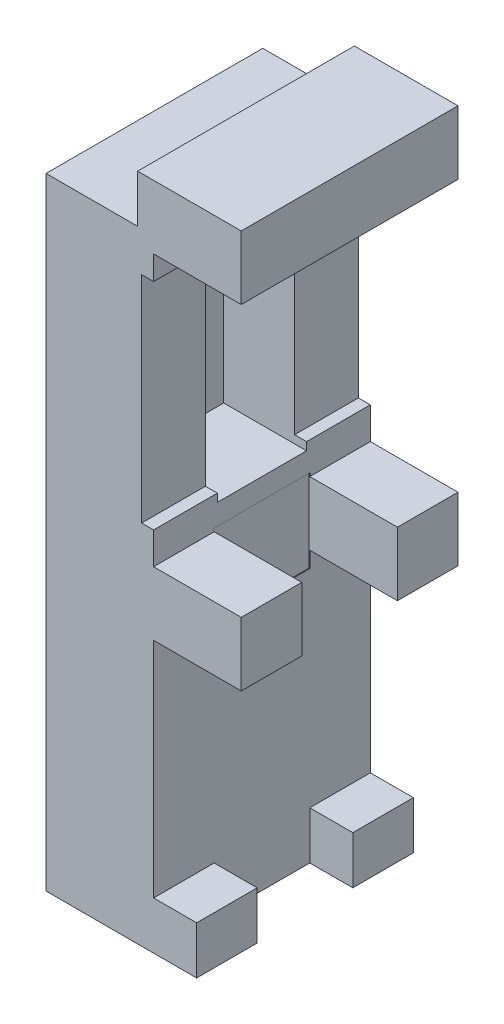
ISO-10303-21;
HEADER;
FILE_DESCRIPTION(('STEP AP214'),'2;1');
FILE_NAME('part.step','',(''),(''),'','','');
FILE_SCHEMA(('AUTOMOTIVE_DESIGN { 1 0 10303 214 1 1 1 1 }'));
ENDSEC;
DATA;
#1=APPLICATION_CONTEXT('core data for automotive mechanical design processes');
#2=APPLICATION_PROTOCOL_DEFINITION('international standard','automotive_design',2000,#1);
#3=PRODUCT_CONTEXT('',#1,'mechanical');
#4=PRODUCT('Part','Part','',(#3));
#5=PRODUCT_RELATED_PRODUCT_CATEGORY('part','',(#4));
#6=PRODUCT_DEFINITION_FORMATION('','',#4);
#7=PRODUCT_DEFINITION_CONTEXT('part definition',#1,'design');
#8=PRODUCT_DEFINITION('design','',#6,#7);
#9=PRODUCT_DEFINITION_SHAPE('','',#8);
#10=(LENGTH_UNIT() NAMED_UNIT(*) SI_UNIT(.MILLI.,.METRE.));
#11=(NAMED_UNIT(*) PLANE_ANGLE_UNIT() SI_UNIT($,.RADIAN.));
#12=(NAMED_UNIT(*) SI_UNIT($,.STERADIAN.) SOLID_ANGLE_UNIT());
#13=UNCERTAINTY_MEASURE_WITH_UNIT(LENGTH_MEASURE(1.E-05),#10,'distance_accuracy_value','');
#14=(GEOMETRIC_REPRESENTATION_CONTEXT(3) GLOBAL_UNCERTAINTY_ASSIGNED_CONTEXT((#13)) GLOBAL_UNIT_ASSIGNED_CONTEXT((#10,
#11,#12)) REPRESENTATION_CONTEXT('',''));
#15=CARTESIAN_POINT('',(0.,0.,0.));
#16=DIRECTION('',(0.,0.,1.));
#17=DIRECTION('',(1.,0.,0.));
#18=AXIS2_PLACEMENT_3D('',#15,#16,#17);
#19=CARTESIAN_POINT('',(-10.2,32.,13.6));
#20=DIRECTION('',(-1.,0.,0.));
#21=DIRECTION('',(0.,0.,1.));
#22=AXIS2_PLACEMENT_3D('',#19,#20,#21);
#23=PLANE('',#22);
#24=DIRECTION('',(0.,-1.,0.));
#25=VECTOR('',#24,1.);
#26=CARTESIAN_POINT('',(-10.2,32.,9.8));
#27=LINE('',#26,#25);
#28=CARTESIAN_POINT('',(-10.2,18.,9.8));
#29=VERTEX_POINT('',#28);
#30=CARTESIAN_POINT('',(-10.2,15.,9.8));
#31=VERTEX_POINT('',#30);
#32=EDGE_CURVE('E11',#29,#31,#27,.T.);
#33=ORIENTED_EDGE('',*,*,#32,.T.);
#34=DIRECTION('',(0.,0.,-1.));
#35=VECTOR('',#34,1.);
#36=CARTESIAN_POINT('',(-10.2,15.,13.6));
#37=LINE('',#36,#35);
#38=CARTESIAN_POINT('',(-10.2,15.,3.8));
#39=VERTEX_POINT('',#38);
#40=EDGE_CURVE('E292',#31,#39,#37,.T.);
#41=ORIENTED_EDGE('',*,*,#40,.T.);
#42=DIRECTION('',(0.,-1.,0.));
#43=VECTOR('',#42,1.);
#44=CARTESIAN_POINT('',(-10.2,32.,3.8));
#45=LINE('',#44,#43);
#46=CARTESIAN_POINT('',(-10.2,18.,3.8));
#47=VERTEX_POINT('',#46);
#48=EDGE_CURVE('E46',#47,#39,#45,.T.);
#49=ORIENTED_EDGE('',*,*,#48,.F.);
#50=DIRECTION('',(0.,0.,1.));
#51=VECTOR('',#50,1.);
#52=CARTESIAN_POINT('',(-10.2,18.,13.6));
#53=LINE('',#52,#51);
#54=CARTESIAN_POINT('',(-10.2,18.,0.));
#55=VERTEX_POINT('',#54);
#56=EDGE_CURVE('E429',#55,#47,#53,.T.);
#57=ORIENTED_EDGE('',*,*,#56,.F.);
#58=DIRECTION('',(0.,1.,0.));
#59=VECTOR('',#58,1.);
#60=CARTESIAN_POINT('',(-10.2,32.,0.));
#61=LINE('',#60,#59);
#62=CARTESIAN_POINT('',(-10.2,32.,0.));
#63=VERTEX_POINT('',#62);
#64=EDGE_CURVE('E306',#55,#63,#61,.T.);
#65=ORIENTED_EDGE('',*,*,#64,.T.);
#66=DIRECTION('',(0.,0.,-1.));
#67=VECTOR('',#66,1.);
#68=CARTESIAN_POINT('',(-10.2,32.,13.6));
#69=LINE('',#68,#67);
#70=CARTESIAN_POINT('',(-10.2,32.,3.8));
#71=VERTEX_POINT('',#70);
#72=EDGE_CURVE('E384',#71,#63,#69,.T.);
#73=ORIENTED_EDGE('',*,*,#72,.F.);
#74=DIRECTION('',(0.,-1.,0.));
#75=VECTOR('',#74,1.);
#76=CARTESIAN_POINT('',(-10.2,32.,3.8));
#77=LINE('',#76,#75);
#78=CARTESIAN_POINT('',(-10.2,31.,3.8));
#79=VERTEX_POINT('',#78);
#80=EDGE_CURVE('E469',#71,#79,#77,.T.);
#81=ORIENTED_EDGE('',*,*,#80,.T.);
#82=DIRECTION('',(0.,0.,1.));
#83=VECTOR('',#82,1.);
#84=CARTESIAN_POINT('',(-10.2,31.,13.6));
#85=LINE('',#84,#83);
#86=CARTESIAN_POINT('',(-10.2,31.,9.8));
#87=VERTEX_POINT('',#86);
#88=EDGE_CURVE('E399',#79,#87,#85,.T.);
#89=ORIENTED_EDGE('',*,*,#88,.T.);
#90=DIRECTION('',(0.,-1.,0.));
#91=VECTOR('',#90,1.);
#92=CARTESIAN_POINT('',(-10.2,32.,9.8));
#93=LINE('',#92,#91);
#94=CARTESIAN_POINT('',(-10.2,32.,9.8));
#95=VERTEX_POINT('',#94);
#96=EDGE_CURVE('E458',#95,#87,#93,.T.);
#97=ORIENTED_EDGE('',*,*,#96,.F.);
#98=CARTESIAN_POINT('',(-10.2,32.,13.6));
#99=VERTEX_POINT('',#98);
#100=EDGE_CURVE('E385',#99,#95,#69,.T.);
#101=ORIENTED_EDGE('',*,*,#100,.F.);
#102=DIRECTION('',(0.,1.,0.));
#103=VECTOR('',#102,1.);
#104=CARTESIAN_POINT('',(-10.2,32.,13.6));
#105=LINE('',#104,#103);
#106=CARTESIAN_POINT('',(-10.2,18.,13.6));
#107=VERTEX_POINT('',#106);
#108=EDGE_CURVE('E342',#107,#99,#105,.T.);
#109=ORIENTED_EDGE('',*,*,#108,.F.);
#110=DIRECTION('',(0.,0.,1.));
#111=VECTOR('',#110,1.);
#112=CARTESIAN_POINT('',(-10.2,18.,13.6));
#113=LINE('',#112,#111);
#114=EDGE_CURVE('E423',#29,#107,#113,.T.);
#115=ORIENTED_EDGE('',*,*,#114,.F.);
#116=EDGE_LOOP('',(#33,#41,#49,#57,#65,#73,#81,#89,#97,#101,#109,#115));
#117=FACE_BOUND('',#116,.T.);
#118=ADVANCED_FACE('F39',(#117),#23,.F.);
#119=CARTESIAN_POINT('',(-4.7,32.,13.6));
#120=DIRECTION('',(0.,1.,0.));
#121=DIRECTION('',(0.,0.,1.));
#122=AXIS2_PLACEMENT_3D('',#119,#120,#121);
#123=PLANE('',#122);
#124=DIRECTION('',(-1.,0.,0.));
#125=VECTOR('',#124,1.);
#126=CARTESIAN_POINT('',(-4.7,32.,9.8));
#127=LINE('',#126,#125);
#128=CARTESIAN_POINT('',(-4.7,32.,9.8));
#129=VERTEX_POINT('',#128);
#130=EDGE_CURVE('E456',#129,#95,#127,.T.);
#131=ORIENTED_EDGE('',*,*,#130,.F.);
#132=DIRECTION('',(0.,0.,-1.));
#133=VECTOR('',#132,1.);
#134=CARTESIAN_POINT('',(-4.7,32.,13.6));
#135=LINE('',#134,#133);
#136=CARTESIAN_POINT('',(-4.7,32.,13.6));
#137=VERTEX_POINT('',#136);
#138=EDGE_CURVE('E381',#137,#129,#135,.T.);
#139=ORIENTED_EDGE('',*,*,#138,.F.);
#140=DIRECTION('',(1.,0.,0.));
#141=VECTOR('',#140,1.);
#142=CARTESIAN_POINT('',(-4.7,32.,13.6));
#143=LINE('',#142,#141);
#144=EDGE_CURVE('E508',#99,#137,#143,.T.);
#145=ORIENTED_EDGE('',*,*,#144,.F.);
#146=ORIENTED_EDGE('',*,*,#100,.T.);
#147=EDGE_LOOP('',(#131,#139,#145,#146));
#148=FACE_BOUND('',#147,.T.);
#149=ADVANCED_FACE('F628',(#148),#123,.F.);
#150=CARTESIAN_POINT('',(-4.7,36.,13.6));
#151=DIRECTION('',(-1.,0.,0.));
#152=DIRECTION('',(0.,0.,1.));
#153=AXIS2_PLACEMENT_3D('',#150,#151,#152);
#154=PLANE('',#153);
#155=DIRECTION('',(0.,-1.,0.));
#156=VECTOR('',#155,1.);
#157=CARTESIAN_POINT('',(-4.7,36.,9.8));
#158=LINE('',#157,#156);
#159=CARTESIAN_POINT('',(-4.7,36.,9.8));
#160=VERTEX_POINT('',#159);
#161=EDGE_CURVE('E454',#160,#129,#158,.T.);
#162=ORIENTED_EDGE('',*,*,#161,.F.);
#163=DIRECTION('',(0.,0.,-1.));
#164=VECTOR('',#163,1.);
#165=CARTESIAN_POINT('',(-4.7,36.,13.6));
#166=LINE('',#165,#164);
#167=CARTESIAN_POINT('',(-4.7,36.,13.6));
#168=VERTEX_POINT('',#167);
#169=EDGE_CURVE('E377',#168,#160,#166,.T.);
#170=ORIENTED_EDGE('',*,*,#169,.F.);
#171=DIRECTION('',(0.,1.,0.));
#172=VECTOR('',#171,1.);
#173=CARTESIAN_POINT('',(-4.7,36.,13.6));
#174=LINE('',#173,#172);
#175=EDGE_CURVE('E510',#137,#168,#174,.T.);
#176=ORIENTED_EDGE('',*,*,#175,.F.);
#177=ORIENTED_EDGE('',*,*,#138,.T.);
#178=EDGE_LOOP('',(#162,#170,#176,#177));
#179=FACE_BOUND('',#178,.T.);
#180=ADVANCED_FACE('F636',(#179),#154,.F.);
#181=CARTESIAN_POINT('',(-10.2,36.,13.6));
#182=DIRECTION('',(0.,-1.,0.));
#183=DIRECTION('',(0.,0.,-1.));
#184=AXIS2_PLACEMENT_3D('',#181,#182,#183);
#185=PLANE('',#184);
#186=DIRECTION('',(1.,0.,0.));
#187=VECTOR('',#186,1.);
#188=CARTESIAN_POINT('',(-10.2,36.,9.8));
#189=LINE('',#188,#187);
#190=CARTESIAN_POINT('',(-10.2,36.,9.8));
#191=VERTEX_POINT('',#190);
#192=EDGE_CURVE('E450',#191,#160,#189,.T.);
#193=ORIENTED_EDGE('',*,*,#192,.F.);
#194=DIRECTION('',(0.,0.,-1.));
#195=VECTOR('',#194,1.);
#196=CARTESIAN_POINT('',(-10.2,36.,13.6));
#197=LINE('',#196,#195);
#198=CARTESIAN_POINT('',(-10.2,36.,13.6));
#199=VERTEX_POINT('',#198);
#200=EDGE_CURVE('E373',#199,#191,#197,.T.);
#201=ORIENTED_EDGE('',*,*,#200,.F.);
#202=DIRECTION('',(-1.,0.,0.));
#203=VECTOR('',#202,1.);
#204=CARTESIAN_POINT('',(-10.2,36.,13.6));
#205=LINE('',#204,#203);
#206=EDGE_CURVE('E512',#168,#199,#205,.T.);
#207=ORIENTED_EDGE('',*,*,#206,.F.);
#208=ORIENTED_EDGE('',*,*,#169,.T.);
#209=EDGE_LOOP('',(#193,#201,#207,#208));
#210=FACE_BOUND('',#209,.T.);
#211=ADVANCED_FACE('F639',(#210),#185,.F.);
#212=CARTESIAN_POINT('',(-10.95,38.,13.6));
#213=DIRECTION('',(0.,-1.,0.));
#214=DIRECTION('',(0.,0.,-1.));
#215=AXIS2_PLACEMENT_3D('',#212,#213,#214);
#216=PLANE('',#215);
#217=DIRECTION('',(1.,0.,0.));
#218=VECTOR('',#217,1.);
#219=CARTESIAN_POINT('',(-10.95,38.,9.6));
#220=LINE('',#219,#218);
#221=CARTESIAN_POINT('',(-10.95,38.,9.6));
#222=VERTEX_POINT('',#221);
#223=CARTESIAN_POINT('',(-10.2,38.,9.6));
#224=VERTEX_POINT('',#223);
#225=EDGE_CURVE('E495',#222,#224,#220,.T.);
#226=ORIENTED_EDGE('',*,*,#225,.F.);
#227=DIRECTION('',(0.,0.,-1.));
#228=VECTOR('',#227,1.);
#229=CARTESIAN_POINT('',(-10.95,38.,13.6));
#230=LINE('',#229,#228);
#231=CARTESIAN_POINT('',(-10.95,38.,13.6));
#232=VERTEX_POINT('',#231);
#233=EDGE_CURVE('E365',#232,#222,#230,.T.);
#234=ORIENTED_EDGE('',*,*,#233,.F.);
#235=DIRECTION('',(-1.,0.,0.));
#236=VECTOR('',#235,1.);
#237=CARTESIAN_POINT('',(-10.95,38.,13.6));
#238=LINE('',#237,#236);
#239=CARTESIAN_POINT('',(-10.2,38.,13.6));
#240=VERTEX_POINT('',#239);
#241=EDGE_CURVE('E516',#240,#232,#238,.T.);
#242=ORIENTED_EDGE('',*,*,#241,.F.);
#243=DIRECTION('',(0.,0.,-1.));
#244=VECTOR('',#243,1.);
#245=CARTESIAN_POINT('',(-10.2,38.,13.6));
#246=LINE('',#245,#244);
#247=EDGE_CURVE('E369',#240,#224,#246,.T.);
#248=ORIENTED_EDGE('',*,*,#247,.T.);
#249=EDGE_LOOP('',(#226,#234,#242,#248));
#250=FACE_BOUND('',#249,.T.);
#251=ADVANCED_FACE('F650',(#250),#216,.F.);
#252=CARTESIAN_POINT('',(-10.95,51.5,13.6));
#253=DIRECTION('',(-1.,0.,0.));
#254=DIRECTION('',(0.,0.,1.));
#255=AXIS2_PLACEMENT_3D('',#252,#253,#254);
#256=PLANE('',#255);
#257=DIRECTION('',(0.,-1.,0.));
#258=VECTOR('',#257,1.);
#259=CARTESIAN_POINT('',(-10.95,51.5,9.6));
#260=LINE('',#259,#258);
#261=CARTESIAN_POINT('',(-10.95,51.5,9.6));
#262=VERTEX_POINT('',#261);
#263=EDGE_CURVE('E491',#262,#222,#260,.T.);
#264=ORIENTED_EDGE('',*,*,#263,.F.);
#265=DIRECTION('',(0.,0.,-1.));
#266=VECTOR('',#265,1.);
#267=CARTESIAN_POINT('',(-10.95,51.5,13.6));
#268=LINE('',#267,#266);
#269=CARTESIAN_POINT('',(-10.95,51.5,13.6));
#270=VERTEX_POINT('',#269);
#271=EDGE_CURVE('E361',#270,#262,#268,.T.);
#272=ORIENTED_EDGE('',*,*,#271,.F.);
#273=DIRECTION('',(0.,1.,0.));
#274=VECTOR('',#273,1.);
#275=CARTESIAN_POINT('',(-10.95,51.5,13.6));
#276=LINE('',#275,#274);
#277=EDGE_CURVE('E518',#232,#270,#276,.T.);
#278=ORIENTED_EDGE('',*,*,#277,.F.);
#279=ORIENTED_EDGE('',*,*,#233,.T.);
#280=EDGE_LOOP('',(#264,#272,#278,#279));
#281=FACE_BOUND('',#280,.T.);
#282=ADVANCED_FACE('F653',(#281),#256,.F.);
#283=CARTESIAN_POINT('',(-4.7,32.,3.8));
#284=VERTEX_POINT('',#283);
#285=CARTESIAN_POINT('',(-4.7,32.,0.));
#286=VERTEX_POINT('',#285);
#287=EDGE_CURVE('E380',#284,#286,#135,.T.);
#288=ORIENTED_EDGE('',*,*,#287,.F.);
#289=DIRECTION('',(-1.,0.,0.));
#290=VECTOR('',#289,1.);
#291=CARTESIAN_POINT('',(-4.7,32.,3.8));
#292=LINE('',#291,#290);
#293=EDGE_CURVE('E466',#284,#71,#292,.T.);
#294=ORIENTED_EDGE('',*,*,#293,.T.);
#295=ORIENTED_EDGE('',*,*,#72,.T.);
#296=DIRECTION('',(1.,0.,0.));
#297=VECTOR('',#296,1.);
#298=CARTESIAN_POINT('',(-4.7,32.,0.));
#299=LINE('',#298,#297);
#300=EDGE_CURVE('E308',#63,#286,#299,.T.);
#301=ORIENTED_EDGE('',*,*,#300,.T.);
#302=EDGE_LOOP('',(#288,#294,#295,#301));
#303=FACE_BOUND('',#302,.T.);
#304=ADVANCED_FACE('F589',(#303),#123,.F.);
#305=CARTESIAN_POINT('',(-4.7,36.,3.8));
#306=VERTEX_POINT('',#305);
#307=CARTESIAN_POINT('',(-4.7,36.,0.));
#308=VERTEX_POINT('',#307);
#309=EDGE_CURVE('E376',#306,#308,#166,.T.);
#310=ORIENTED_EDGE('',*,*,#309,.F.);
#311=DIRECTION('',(0.,-1.,0.));
#312=VECTOR('',#311,1.);
#313=CARTESIAN_POINT('',(-4.7,36.,3.8));
#314=LINE('',#313,#312);
#315=EDGE_CURVE('E463',#306,#284,#314,.T.);
#316=ORIENTED_EDGE('',*,*,#315,.T.);
#317=ORIENTED_EDGE('',*,*,#287,.T.);
#318=DIRECTION('',(0.,1.,0.));
#319=VECTOR('',#318,1.);
#320=CARTESIAN_POINT('',(-4.7,36.,0.));
#321=LINE('',#320,#319);
#322=EDGE_CURVE('E312',#286,#308,#321,.T.);
#323=ORIENTED_EDGE('',*,*,#322,.T.);
#324=EDGE_LOOP('',(#310,#316,#317,#323));
#325=FACE_BOUND('',#324,.T.);
#326=ADVANCED_FACE('F585',(#325),#154,.F.);
#327=CARTESIAN_POINT('',(-10.2,36.,3.8));
#328=VERTEX_POINT('',#327);
#329=CARTESIAN_POINT('',(-10.2,36.,0.));
#330=VERTEX_POINT('',#329);
#331=EDGE_CURVE('E372',#328,#330,#197,.T.);
#332=ORIENTED_EDGE('',*,*,#331,.F.);
#333=DIRECTION('',(1.,0.,0.));
#334=VECTOR('',#333,1.);
#335=CARTESIAN_POINT('',(-10.2,36.,3.8));
#336=LINE('',#335,#334);
#337=EDGE_CURVE('E460',#328,#306,#336,.T.);
#338=ORIENTED_EDGE('',*,*,#337,.T.);
#339=ORIENTED_EDGE('',*,*,#309,.T.);
#340=DIRECTION('',(-1.,0.,0.));
#341=VECTOR('',#340,1.);
#342=CARTESIAN_POINT('',(-10.2,36.,0.));
#343=LINE('',#342,#341);
#344=EDGE_CURVE('E315',#308,#330,#343,.T.);
#345=ORIENTED_EDGE('',*,*,#344,.T.);
#346=EDGE_LOOP('',(#332,#338,#339,#345));
#347=FACE_BOUND('',#346,.T.);
#348=ADVANCED_FACE('F580',(#347),#185,.F.);
#349=CARTESIAN_POINT('',(-10.2,38.,13.6));
#350=DIRECTION('',(-1.,0.,0.));
#351=DIRECTION('',(0.,0.,1.));
#352=AXIS2_PLACEMENT_3D('',#349,#350,#351);
#353=PLANE('',#352);
#354=DIRECTION('',(0.,0.,-1.));
#355=VECTOR('',#354,1.);
#356=CARTESIAN_POINT('',(-10.2,36.2,13.6));
#357=LINE('',#356,#355);
#358=CARTESIAN_POINT('',(-10.2,36.2,9.8));
#359=VERTEX_POINT('',#358);
#360=CARTESIAN_POINT('',(-10.2,36.2,3.8));
#361=VERTEX_POINT('',#360);
#362=EDGE_CURVE('E393',#359,#361,#357,.T.);
#363=ORIENTED_EDGE('',*,*,#362,.T.);
#364=DIRECTION('',(0.,-1.,0.));
#365=VECTOR('',#364,1.);
#366=CARTESIAN_POINT('',(-10.2,38.,3.8));
#367=LINE('',#366,#365);
#368=EDGE_CURVE('E396',#361,#328,#367,.T.);
#369=ORIENTED_EDGE('',*,*,#368,.T.);
#370=ORIENTED_EDGE('',*,*,#331,.T.);
#371=DIRECTION('',(0.,1.,0.));
#372=VECTOR('',#371,1.);
#373=CARTESIAN_POINT('',(-10.2,38.,0.));
#374=LINE('',#373,#372);
#375=CARTESIAN_POINT('',(-10.2,38.,0.));
#376=VERTEX_POINT('',#375);
#377=EDGE_CURVE('E318',#330,#376,#374,.T.);
#378=ORIENTED_EDGE('',*,*,#377,.T.);
#379=CARTESIAN_POINT('',(-10.2,38.,4.));
#380=VERTEX_POINT('',#379);
#381=EDGE_CURVE('E368',#380,#376,#246,.T.);
#382=ORIENTED_EDGE('',*,*,#381,.F.);
#383=DIRECTION('',(0.,-1.,0.));
#384=VECTOR('',#383,1.);
#385=CARTESIAN_POINT('',(-10.2,38.,4.));
#386=LINE('',#385,#384);
#387=CARTESIAN_POINT('',(-10.2,37.5,4.));
#388=VERTEX_POINT('',#387);
#389=EDGE_CURVE('E309',#380,#388,#386,.T.);
#390=ORIENTED_EDGE('',*,*,#389,.T.);
#391=DIRECTION('',(0.,0.,1.));
#392=VECTOR('',#391,1.);
#393=CARTESIAN_POINT('',(-10.2,37.5,13.6));
#394=LINE('',#393,#392);
#395=CARTESIAN_POINT('',(-10.2,37.5,9.6));
#396=VERTEX_POINT('',#395);
#397=EDGE_CURVE('E388',#388,#396,#394,.T.);
#398=ORIENTED_EDGE('',*,*,#397,.T.);
#399=DIRECTION('',(0.,-1.,0.));
#400=VECTOR('',#399,1.);
#401=CARTESIAN_POINT('',(-10.2,38.,9.6));
#402=LINE('',#401,#400);
#403=EDGE_CURVE('E497',#224,#396,#402,.T.);
#404=ORIENTED_EDGE('',*,*,#403,.F.);
#405=ORIENTED_EDGE('',*,*,#247,.F.);
#406=DIRECTION('',(0.,1.,0.));
#407=VECTOR('',#406,1.);
#408=CARTESIAN_POINT('',(-10.2,38.,13.6));
#409=LINE('',#408,#407);
#410=EDGE_CURVE('E514',#199,#240,#409,.T.);
#411=ORIENTED_EDGE('',*,*,#410,.F.);
#412=ORIENTED_EDGE('',*,*,#200,.T.);
#413=DIRECTION('',(0.,-1.,0.));
#414=VECTOR('',#413,1.);
#415=CARTESIAN_POINT('',(-10.2,38.,9.8));
#416=LINE('',#415,#414);
#417=EDGE_CURVE('E391',#359,#191,#416,.T.);
#418=ORIENTED_EDGE('',*,*,#417,.F.);
#419=EDGE_LOOP('',(#363,#369,#370,#378,#382,#390,#398,#404,#405,#411,#412,#418));
#420=FACE_BOUND('',#419,.T.);
#421=ADVANCED_FACE('F577',(#420),#353,.F.);
#422=CARTESIAN_POINT('',(-10.95,38.,4.));
#423=VERTEX_POINT('',#422);
#424=CARTESIAN_POINT('',(-10.95,38.,0.));
#425=VERTEX_POINT('',#424);
#426=EDGE_CURVE('E364',#423,#425,#230,.T.);
#427=ORIENTED_EDGE('',*,*,#426,.F.);
#428=DIRECTION('',(1.,0.,0.));
#429=VECTOR('',#428,1.);
#430=CARTESIAN_POINT('',(-10.95,38.,4.));
#431=LINE('',#430,#429);
#432=EDGE_CURVE('E502',#423,#380,#431,.T.);
#433=ORIENTED_EDGE('',*,*,#432,.T.);
#434=ORIENTED_EDGE('',*,*,#381,.T.);
#435=DIRECTION('',(-1.,0.,0.));
#436=VECTOR('',#435,1.);
#437=CARTESIAN_POINT('',(-10.95,38.,0.));
#438=LINE('',#437,#436);
#439=EDGE_CURVE('E321',#376,#425,#438,.T.);
#440=ORIENTED_EDGE('',*,*,#439,.T.);
#441=EDGE_LOOP('',(#427,#433,#434,#440));
#442=FACE_BOUND('',#441,.T.);
#443=ADVANCED_FACE('F574',(#442),#216,.F.);
#444=CARTESIAN_POINT('',(-10.95,51.5,4.));
#445=VERTEX_POINT('',#444);
#446=CARTESIAN_POINT('',(-10.95,51.5,0.));
#447=VERTEX_POINT('',#446);
#448=EDGE_CURVE('E360',#445,#447,#268,.T.);
#449=ORIENTED_EDGE('',*,*,#448,.F.);
#450=DIRECTION('',(0.,-1.,0.));
#451=VECTOR('',#450,1.);
#452=CARTESIAN_POINT('',(-10.95,51.5,4.));
#453=LINE('',#452,#451);
#454=EDGE_CURVE('E499',#445,#423,#453,.T.);
#455=ORIENTED_EDGE('',*,*,#454,.T.);
#456=ORIENTED_EDGE('',*,*,#426,.T.);
#457=DIRECTION('',(0.,1.,0.));
#458=VECTOR('',#457,1.);
#459=CARTESIAN_POINT('',(-10.95,51.5,0.));
#460=LINE('',#459,#458);
#461=EDGE_CURVE('E324',#425,#447,#460,.T.);
#462=ORIENTED_EDGE('',*,*,#461,.T.);
#463=EDGE_LOOP('',(#449,#455,#456,#462));
#464=FACE_BOUND('',#463,.T.);
#465=ADVANCED_FACE('F568',(#464),#256,.F.);
#466=CARTESIAN_POINT('',(-10.2,51.5,13.6));
#467=DIRECTION('',(0.,1.,0.));
#468=DIRECTION('',(0.,0.,1.));
#469=AXIS2_PLACEMENT_3D('',#466,#467,#468);
#470=PLANE('',#469);
#471=DIRECTION('',(1.,0.,0.));
#472=VECTOR('',#471,1.);
#473=CARTESIAN_POINT('',(-10.2,51.5,0.));
#474=LINE('',#473,#472);
#475=CARTESIAN_POINT('',(-10.2,51.5,0.));
#476=VERTEX_POINT('',#475);
#477=EDGE_CURVE('E327',#447,#476,#474,.T.);
#478=ORIENTED_EDGE('',*,*,#477,.T.);
#479=DIRECTION('',(0.,0.,-1.));
#480=VECTOR('',#479,1.);
#481=CARTESIAN_POINT('',(-10.2,51.5,13.6));
#482=LINE('',#481,#480);
#483=CARTESIAN_POINT('',(-10.2,51.5,13.6));
#484=VERTEX_POINT('',#483);
#485=EDGE_CURVE('E358',#484,#476,#482,.T.);
#486=ORIENTED_EDGE('',*,*,#485,.F.);
#487=DIRECTION('',(1.,0.,0.));
#488=VECTOR('',#487,1.);
#489=CARTESIAN_POINT('',(-10.2,51.5,13.6));
#490=LINE('',#489,#488);
#491=EDGE_CURVE('E520',#270,#484,#490,.T.);
#492=ORIENTED_EDGE('',*,*,#491,.F.);
#493=ORIENTED_EDGE('',*,*,#271,.T.);
#494=DIRECTION('',(-1.,0.,0.));
#495=VECTOR('',#494,1.);
#496=CARTESIAN_POINT('',(-15.4,51.5,9.6));
#497=LINE('',#496,#495);
#498=CARTESIAN_POINT('',(-15.4,51.5,9.6));
#499=VERTEX_POINT('',#498);
#500=EDGE_CURVE('E472',#262,#499,#497,.T.);
#501=ORIENTED_EDGE('',*,*,#500,.T.);
#502=DIRECTION('',(0.,0.,1.));
#503=VECTOR('',#502,1.);
#504=CARTESIAN_POINT('',(-15.4,51.5,4.));
#505=LINE('',#504,#503);
#506=CARTESIAN_POINT('',(-15.4,51.5,4.));
#507=VERTEX_POINT('',#506);
#508=EDGE_CURVE('E482',#507,#499,#505,.T.);
#509=ORIENTED_EDGE('',*,*,#508,.F.);
#510=DIRECTION('',(-1.,0.,0.));
#511=VECTOR('',#510,1.);
#512=CARTESIAN_POINT('',(-15.4,51.5,4.));
#513=LINE('',#512,#511);
#514=EDGE_CURVE('E473',#445,#507,#513,.T.);
#515=ORIENTED_EDGE('',*,*,#514,.F.);
#516=ORIENTED_EDGE('',*,*,#448,.T.);
#517=EDGE_LOOP('',(#478,#486,#492,#493,#501,#509,#515,#516));
#518=FACE_BOUND('',#517,.T.);
#519=ADVANCED_FACE('F563',(#518),#470,.F.);
#520=CARTESIAN_POINT('',(-10.2,53.,13.6));
#521=DIRECTION('',(-1.,0.,0.));
#522=DIRECTION('',(0.,0.,1.));
#523=AXIS2_PLACEMENT_3D('',#520,#521,#522);
#524=PLANE('',#523);
#525=DIRECTION('',(0.,1.,0.));
#526=VECTOR('',#525,1.);
#527=CARTESIAN_POINT('',(-10.2,53.,0.));
#528=LINE('',#527,#526);
#529=CARTESIAN_POINT('',(-10.2,53.,0.));
#530=VERTEX_POINT('',#529);
#531=EDGE_CURVE('E330',#476,#530,#528,.T.);
#532=ORIENTED_EDGE('',*,*,#531,.T.);
#533=DIRECTION('',(0.,0.,-1.));
#534=VECTOR('',#533,1.);
#535=CARTESIAN_POINT('',(-10.2,53.,13.6));
#536=LINE('',#535,#534);
#537=CARTESIAN_POINT('',(-10.2,53.,13.6));
#538=VERTEX_POINT('',#537);
#539=EDGE_CURVE('E355',#538,#530,#536,.T.);
#540=ORIENTED_EDGE('',*,*,#539,.F.);
#541=DIRECTION('',(0.,1.,0.));
#542=VECTOR('',#541,1.);
#543=CARTESIAN_POINT('',(-10.2,53.,13.6));
#544=LINE('',#543,#542);
#545=EDGE_CURVE('E522',#484,#538,#544,.T.);
#546=ORIENTED_EDGE('',*,*,#545,.F.);
#547=ORIENTED_EDGE('',*,*,#485,.T.);
#548=EDGE_LOOP('',(#532,#540,#546,#547));
#549=FACE_BOUND('',#548,.T.);
#550=ADVANCED_FACE('F558',(#549),#524,.F.);
#551=CARTESIAN_POINT('',(-4.7,53.,13.6));
#552=DIRECTION('',(0.,1.,0.));
#553=DIRECTION('',(0.,0.,1.));
#554=AXIS2_PLACEMENT_3D('',#551,#552,#553);
#555=PLANE('',#554);
#556=DIRECTION('',(1.,0.,0.));
#557=VECTOR('',#556,1.);
#558=CARTESIAN_POINT('',(-4.7,53.,0.));
#559=LINE('',#558,#557);
#560=CARTESIAN_POINT('',(-4.7,53.,0.));
#561=VERTEX_POINT('',#560);
#562=EDGE_CURVE('E332',#530,#561,#559,.T.);
#563=ORIENTED_EDGE('',*,*,#562,.T.);
#564=DIRECTION('',(0.,0.,-1.));
#565=VECTOR('',#564,1.);
#566=CARTESIAN_POINT('',(-4.7,53.,13.6));
#567=LINE('',#566,#565);
#568=CARTESIAN_POINT('',(-4.7,53.,13.6));
#569=VERTEX_POINT('',#568);
#570=EDGE_CURVE('E352',#569,#561,#567,.T.);
#571=ORIENTED_EDGE('',*,*,#570,.F.);
#572=DIRECTION('',(1.,0.,0.));
#573=VECTOR('',#572,1.);
#574=CARTESIAN_POINT('',(-4.7,53.,13.6));
#575=LINE('',#574,#573);
#576=EDGE_CURVE('E524',#538,#569,#575,.T.);
#577=ORIENTED_EDGE('',*,*,#576,.F.);
#578=ORIENTED_EDGE('',*,*,#539,.T.);
#579=EDGE_LOOP('',(#563,#571,#577,#578));
#580=FACE_BOUND('',#579,.T.);
#581=ADVANCED_FACE('F552',(#580),#555,.F.);
#582=CARTESIAN_POINT('',(-4.7,57.,13.6));
#583=DIRECTION('',(-1.,0.,0.));
#584=DIRECTION('',(0.,0.,1.));
#585=AXIS2_PLACEMENT_3D('',#582,#583,#584);
#586=PLANE('',#585);
#587=DIRECTION('',(0.,1.,0.));
#588=VECTOR('',#587,1.);
#589=CARTESIAN_POINT('',(-4.7,57.,0.));
#590=LINE('',#589,#588);
#591=CARTESIAN_POINT('',(-4.7,57.,0.));
#592=VERTEX_POINT('',#591);
#593=EDGE_CURVE('E334',#561,#592,#590,.T.);
#594=ORIENTED_EDGE('',*,*,#593,.T.);
#595=DIRECTION('',(0.,0.,-1.));
#596=VECTOR('',#595,1.);
#597=CARTESIAN_POINT('',(-4.7,57.,13.6));
#598=LINE('',#597,#596);
#599=CARTESIAN_POINT('',(-4.7,57.,13.6));
#600=VERTEX_POINT('',#599);
#601=EDGE_CURVE('E349',#600,#592,#598,.T.);
#602=ORIENTED_EDGE('',*,*,#601,.F.);
#603=DIRECTION('',(0.,1.,0.));
#604=VECTOR('',#603,1.);
#605=CARTESIAN_POINT('',(-4.7,57.,13.6));
#606=LINE('',#605,#604);
#607=EDGE_CURVE('E526',#569,#600,#606,.T.);
#608=ORIENTED_EDGE('',*,*,#607,.F.);
#609=ORIENTED_EDGE('',*,*,#570,.T.);
#610=EDGE_LOOP('',(#594,#602,#608,#609));
#611=FACE_BOUND('',#610,.T.);
#612=ADVANCED_FACE('F548',(#611),#586,.F.);
#613=CARTESIAN_POINT('',(-11.2,57.,13.6));
#614=DIRECTION('',(0.,-1.,0.));
#615=DIRECTION('',(0.,0.,-1.));
#616=AXIS2_PLACEMENT_3D('',#613,#614,#615);
#617=PLANE('',#616);
#618=DIRECTION('',(-1.,0.,0.));
#619=VECTOR('',#618,1.);
#620=CARTESIAN_POINT('',(-11.2,57.,0.));
#621=LINE('',#620,#619);
#622=CARTESIAN_POINT('',(-11.2,57.,0.));
#623=VERTEX_POINT('',#622);
#624=EDGE_CURVE('E336',#592,#623,#621,.T.);
#625=ORIENTED_EDGE('',*,*,#624,.T.);
#626=DIRECTION('',(0.,0.,-1.));
#627=VECTOR('',#626,1.);
#628=CARTESIAN_POINT('',(-11.2,57.,13.6));
#629=LINE('',#628,#627);
#630=CARTESIAN_POINT('',(-11.2,57.,13.6));
#631=VERTEX_POINT('',#630);
#632=EDGE_CURVE('E346',#631,#623,#629,.T.);
#633=ORIENTED_EDGE('',*,*,#632,.F.);
#634=DIRECTION('',(-1.,0.,0.));
#635=VECTOR('',#634,1.);
#636=CARTESIAN_POINT('',(-11.2,57.,13.6));
#637=LINE('',#636,#635);
#638=EDGE_CURVE('E528',#600,#631,#637,.T.);
#639=ORIENTED_EDGE('',*,*,#638,.F.);
#640=ORIENTED_EDGE('',*,*,#601,.T.);
#641=EDGE_LOOP('',(#625,#633,#639,#640));
#642=FACE_BOUND('',#641,.T.);
#643=ADVANCED_FACE('F544',(#642),#617,.F.);
#644=CARTESIAN_POINT('',(-11.2,54.,13.6));
#645=DIRECTION('',(1.,0.,0.));
#646=DIRECTION('',(0.,0.,-1.));
#647=AXIS2_PLACEMENT_3D('',#644,#645,#646);
#648=PLANE('',#647);
#649=DIRECTION('',(0.,-1.,0.));
#650=VECTOR('',#649,1.);
#651=CARTESIAN_POINT('',(-11.2,54.,0.));
#652=LINE('',#651,#650);
#653=CARTESIAN_POINT('',(-11.2,54.,0.));
#654=VERTEX_POINT('',#653);
#655=EDGE_CURVE('E338',#623,#654,#652,.T.);
#656=ORIENTED_EDGE('',*,*,#655,.T.);
#657=DIRECTION('',(0.,0.,-1.));
#658=VECTOR('',#657,1.);
#659=CARTESIAN_POINT('',(-11.2,54.,13.6));
#660=LINE('',#659,#658);
#661=CARTESIAN_POINT('',(-11.2,54.,13.6));
#662=VERTEX_POINT('',#661);
#663=EDGE_CURVE('E300',#662,#654,#660,.T.);
#664=ORIENTED_EDGE('',*,*,#663,.F.);
#665=DIRECTION('',(0.,-1.,0.));
#666=VECTOR('',#665,1.);
#667=CARTESIAN_POINT('',(-11.2,54.,13.6));
#668=LINE('',#667,#666);
#669=EDGE_CURVE('E302',#631,#662,#668,.T.);
#670=ORIENTED_EDGE('',*,*,#669,.F.);
#671=ORIENTED_EDGE('',*,*,#632,.T.);
#672=EDGE_LOOP('',(#656,#664,#670,#671));
#673=FACE_BOUND('',#672,.T.);
#674=ADVANCED_FACE('F534',(#673),#648,.F.);
#675=CARTESIAN_POINT('',(-16.95,54.,13.6));
#676=DIRECTION('',(0.,-1.,0.));
#677=DIRECTION('',(0.,0.,-1.));
#678=AXIS2_PLACEMENT_3D('',#675,#676,#677);
#679=PLANE('',#678);
#680=DIRECTION('',(-1.,0.,0.));
#681=VECTOR('',#680,1.);
#682=CARTESIAN_POINT('',(-16.95,54.,0.));
#683=LINE('',#682,#681);
#684=CARTESIAN_POINT('',(-16.95,54.,0.));
#685=VERTEX_POINT('',#684);
#686=EDGE_CURVE('E340',#654,#685,#683,.T.);
#687=ORIENTED_EDGE('',*,*,#686,.T.);
#688=DIRECTION('',(0.,0.,-1.));
#689=VECTOR('',#688,1.);
#690=CARTESIAN_POINT('',(-16.95,54.,13.6));
#691=LINE('',#690,#689);
#692=CARTESIAN_POINT('',(-16.95,54.,13.6));
#693=VERTEX_POINT('',#692);
#694=EDGE_CURVE('E298',#693,#685,#691,.T.);
#695=ORIENTED_EDGE('',*,*,#694,.F.);
#696=DIRECTION('',(-1.,0.,0.));
#697=VECTOR('',#696,1.);
#698=CARTESIAN_POINT('',(-16.95,54.,13.6));
#699=LINE('',#698,#697);
#700=EDGE_CURVE('E296',#662,#693,#699,.T.);
#701=ORIENTED_EDGE('',*,*,#700,.F.);
#702=ORIENTED_EDGE('',*,*,#663,.T.);
#703=EDGE_LOOP('',(#687,#695,#701,#702));
#704=FACE_BOUND('',#703,.T.);
#705=ADVANCED_FACE('F538',(#704),#679,.F.);
#706=CARTESIAN_POINT('',(-16.95,0.,13.6));
#707=DIRECTION('',(1.,0.,0.));
#708=DIRECTION('',(0.,0.,-1.));
#709=AXIS2_PLACEMENT_3D('',#706,#707,#708);
#710=PLANE('',#709);
#711=DIRECTION('',(0.,-1.,0.));
#712=VECTOR('',#711,1.);
#713=CARTESIAN_POINT('',(-16.95,0.,0.));
#714=LINE('',#713,#712);
#715=CARTESIAN_POINT('',(-16.95,15.,0.));
#716=VERTEX_POINT('',#715);
#717=EDGE_CURVE('E290',#685,#716,#714,.T.);
#718=ORIENTED_EDGE('',*,*,#717,.T.);
#719=DIRECTION('',(0.,0.,1.));
#720=VECTOR('',#719,1.);
#721=CARTESIAN_POINT('',(-16.95,15.,13.6));
#722=LINE('',#721,#720);
#723=CARTESIAN_POINT('',(-16.95,15.,13.6));
#724=VERTEX_POINT('',#723);
#725=EDGE_CURVE('E275',#716,#724,#722,.T.);
#726=ORIENTED_EDGE('',*,*,#725,.T.);
#727=DIRECTION('',(0.,-1.,0.));
#728=VECTOR('',#727,1.);
#729=CARTESIAN_POINT('',(-16.95,0.,13.6));
#730=LINE('',#729,#728);
#731=EDGE_CURVE('E289',#693,#724,#730,.T.);
#732=ORIENTED_EDGE('',*,*,#731,.F.);
#733=ORIENTED_EDGE('',*,*,#694,.T.);
#734=EDGE_LOOP('',(#718,#726,#732,#733));
#735=FACE_BOUND('',#734,.T.);
#736=ADVANCED_FACE('F287',(#735),#710,.F.);
#737=CARTESIAN_POINT('',(0.,0.,13.6));
#738=DIRECTION('',(0.,0.,-1.));
#739=DIRECTION('',(-1.,0.,0.));
#740=AXIS2_PLACEMENT_3D('',#737,#738,#739);
#741=PLANE('',#740);
#742=ORIENTED_EDGE('',*,*,#731,.T.);
#743=DIRECTION('',(1.,0.,0.));
#744=VECTOR('',#743,1.);
#745=CARTESIAN_POINT('',(-7.5,15.,13.6));
#746=LINE('',#745,#744);
#747=CARTESIAN_POINT('',(-7.5,15.,13.6));
#748=VERTEX_POINT('',#747);
#749=EDGE_CURVE('E271',#724,#748,#746,.T.);
#750=ORIENTED_EDGE('',*,*,#749,.T.);
#751=DIRECTION('',(0.,1.,0.));
#752=VECTOR('',#751,1.);
#753=CARTESIAN_POINT('',(-7.5,18.,13.6));
#754=LINE('',#753,#752);
#755=CARTESIAN_POINT('',(-7.5,18.,13.6));
#756=VERTEX_POINT('',#755);
#757=EDGE_CURVE('E604',#748,#756,#754,.T.);
#758=ORIENTED_EDGE('',*,*,#757,.T.);
#759=DIRECTION('',(-1.,0.,0.));
#760=VECTOR('',#759,1.);
#761=CARTESIAN_POINT('',(-11.2,18.,13.6));
#762=LINE('',#761,#760);
#763=EDGE_CURVE('E283',#756,#107,#762,.T.);
#764=ORIENTED_EDGE('',*,*,#763,.T.);
#765=ORIENTED_EDGE('',*,*,#108,.T.);
#766=ORIENTED_EDGE('',*,*,#144,.T.);
#767=ORIENTED_EDGE('',*,*,#175,.T.);
#768=ORIENTED_EDGE('',*,*,#206,.T.);
#769=ORIENTED_EDGE('',*,*,#410,.T.);
#770=ORIENTED_EDGE('',*,*,#241,.T.);
#771=ORIENTED_EDGE('',*,*,#277,.T.);
#772=ORIENTED_EDGE('',*,*,#491,.T.);
#773=ORIENTED_EDGE('',*,*,#545,.T.);
#774=ORIENTED_EDGE('',*,*,#576,.T.);
#775=ORIENTED_EDGE('',*,*,#607,.T.);
#776=ORIENTED_EDGE('',*,*,#638,.T.);
#777=ORIENTED_EDGE('',*,*,#669,.T.);
#778=ORIENTED_EDGE('',*,*,#700,.T.);
#779=EDGE_LOOP('',(#742,#750,#758,#764,#765,#766,#767,#768,#769,#770,#771,#772,#773,#774,#775,
#776,#777,#778));
#780=FACE_BOUND('',#779,.T.);
#781=ADVANCED_FACE('F294',(#780),#741,.F.);
#782=CARTESIAN_POINT('',(0.,0.,0.));
#783=DIRECTION('',(0.,0.,-1.));
#784=DIRECTION('',(-1.,0.,0.));
#785=AXIS2_PLACEMENT_3D('',#782,#783,#784);
#786=PLANE('',#785);
#787=DIRECTION('',(1.,0.,0.));
#788=VECTOR('',#787,1.);
#789=CARTESIAN_POINT('',(-7.5,15.,0.));
#790=LINE('',#789,#788);
#791=CARTESIAN_POINT('',(-7.5,15.,0.));
#792=VERTEX_POINT('',#791);
#793=EDGE_CURVE('E53',#716,#792,#790,.T.);
#794=ORIENTED_EDGE('',*,*,#793,.F.);
#795=ORIENTED_EDGE('',*,*,#717,.F.);
#796=ORIENTED_EDGE('',*,*,#686,.F.);
#797=ORIENTED_EDGE('',*,*,#655,.F.);
#798=ORIENTED_EDGE('',*,*,#624,.F.);
#799=ORIENTED_EDGE('',*,*,#593,.F.);
#800=ORIENTED_EDGE('',*,*,#562,.F.);
#801=ORIENTED_EDGE('',*,*,#531,.F.);
#802=ORIENTED_EDGE('',*,*,#477,.F.);
#803=ORIENTED_EDGE('',*,*,#461,.F.);
#804=ORIENTED_EDGE('',*,*,#439,.F.);
#805=ORIENTED_EDGE('',*,*,#377,.F.);
#806=ORIENTED_EDGE('',*,*,#344,.F.);
#807=ORIENTED_EDGE('',*,*,#322,.F.);
#808=ORIENTED_EDGE('',*,*,#300,.F.);
#809=ORIENTED_EDGE('',*,*,#64,.F.);
#810=DIRECTION('',(-1.,0.,0.));
#811=VECTOR('',#810,1.);
#812=CARTESIAN_POINT('',(-11.2,18.,0.));
#813=LINE('',#812,#811);
#814=CARTESIAN_POINT('',(-7.5,18.,0.));
#815=VERTEX_POINT('',#814);
#816=EDGE_CURVE('E422',#815,#55,#813,.T.);
#817=ORIENTED_EDGE('',*,*,#816,.F.);
#818=DIRECTION('',(0.,1.,0.));
#819=VECTOR('',#818,1.);
#820=CARTESIAN_POINT('',(-7.5,18.,0.));
#821=LINE('',#820,#819);
#822=EDGE_CURVE('E419',#792,#815,#821,.T.);
#823=ORIENTED_EDGE('',*,*,#822,.F.);
#824=EDGE_LOOP('',(#794,#795,#796,#797,#798,#799,#800,#801,#802,#803,#804,#805,#806,#807,#808,
#809,#817,#823));
#825=FACE_BOUND('',#824,.T.);
#826=ADVANCED_FACE('F539',(#825),#786,.T.);
#827=CARTESIAN_POINT('',(-7.,37.5,4.));
#828=DIRECTION('',(0.,-1.,0.));
#829=DIRECTION('',(0.,0.,-1.));
#830=AXIS2_PLACEMENT_3D('',#827,#828,#829);
#831=PLANE('',#830);
#832=DIRECTION('',(1.,0.,0.));
#833=VECTOR('',#832,1.);
#834=CARTESIAN_POINT('',(-7.,37.5,4.));
#835=LINE('',#834,#833);
#836=CARTESIAN_POINT('',(-15.4,37.5,4.));
#837=VERTEX_POINT('',#836);
#838=EDGE_CURVE('E479',#837,#388,#835,.T.);
#839=ORIENTED_EDGE('',*,*,#838,.F.);
#840=DIRECTION('',(0.,0.,1.));
#841=VECTOR('',#840,1.);
#842=CARTESIAN_POINT('',(-15.4,37.5,4.));
#843=LINE('',#842,#841);
#844=CARTESIAN_POINT('',(-15.4,37.5,9.6));
#845=VERTEX_POINT('',#844);
#846=EDGE_CURVE('E489',#837,#845,#843,.T.);
#847=ORIENTED_EDGE('',*,*,#846,.T.);
#848=DIRECTION('',(1.,0.,0.));
#849=VECTOR('',#848,1.);
#850=CARTESIAN_POINT('',(-7.,37.5,9.6));
#851=LINE('',#850,#849);
#852=EDGE_CURVE('E476',#845,#396,#851,.T.);
#853=ORIENTED_EDGE('',*,*,#852,.T.);
#854=ORIENTED_EDGE('',*,*,#397,.F.);
#855=EDGE_LOOP('',(#839,#847,#853,#854));
#856=FACE_BOUND('',#855,.T.);
#857=ADVANCED_FACE('F663',(#856),#831,.F.);
#858=CARTESIAN_POINT('',(0.,0.,4.));
#859=DIRECTION('',(0.,0.,-1.));
#860=DIRECTION('',(-1.,0.,0.));
#861=AXIS2_PLACEMENT_3D('',#858,#859,#860);
#862=PLANE('',#861);
#863=ORIENTED_EDGE('',*,*,#432,.F.);
#864=ORIENTED_EDGE('',*,*,#454,.F.);
#865=ORIENTED_EDGE('',*,*,#514,.T.);
#866=DIRECTION('',(0.,-1.,0.));
#867=VECTOR('',#866,1.);
#868=CARTESIAN_POINT('',(-15.4,37.5,4.));
#869=LINE('',#868,#867);
#870=EDGE_CURVE('E475',#507,#837,#869,.T.);
#871=ORIENTED_EDGE('',*,*,#870,.T.);
#872=ORIENTED_EDGE('',*,*,#838,.T.);
#873=ORIENTED_EDGE('',*,*,#389,.F.);
#874=EDGE_LOOP('',(#863,#864,#865,#871,#872,#873));
#875=FACE_BOUND('',#874,.T.);
#876=ADVANCED_FACE('F665',(#875),#862,.F.);
#877=CARTESIAN_POINT('',(0.,0.,9.6));
#878=DIRECTION('',(0.,0.,-1.));
#879=DIRECTION('',(-1.,0.,0.));
#880=AXIS2_PLACEMENT_3D('',#877,#878,#879);
#881=PLANE('',#880);
#882=ORIENTED_EDGE('',*,*,#403,.T.);
#883=ORIENTED_EDGE('',*,*,#852,.F.);
#884=DIRECTION('',(0.,-1.,0.));
#885=VECTOR('',#884,1.);
#886=CARTESIAN_POINT('',(-15.4,37.5,9.6));
#887=LINE('',#886,#885);
#888=EDGE_CURVE('E484',#499,#845,#887,.T.);
#889=ORIENTED_EDGE('',*,*,#888,.F.);
#890=ORIENTED_EDGE('',*,*,#500,.F.);
#891=ORIENTED_EDGE('',*,*,#263,.T.);
#892=ORIENTED_EDGE('',*,*,#225,.T.);
#893=EDGE_LOOP('',(#882,#883,#889,#890,#891,#892));
#894=FACE_BOUND('',#893,.T.);
#895=ADVANCED_FACE('F660',(#894),#881,.T.);
#896=CARTESIAN_POINT('',(-15.4,37.5,4.));
#897=DIRECTION('',(-1.,0.,0.));
#898=DIRECTION('',(0.,0.,1.));
#899=AXIS2_PLACEMENT_3D('',#896,#897,#898);
#900=PLANE('',#899);
#901=ORIENTED_EDGE('',*,*,#888,.T.);
#902=ORIENTED_EDGE('',*,*,#846,.F.);
#903=ORIENTED_EDGE('',*,*,#870,.F.);
#904=ORIENTED_EDGE('',*,*,#508,.T.);
#905=EDGE_LOOP('',(#901,#902,#903,#904));
#906=FACE_BOUND('',#905,.T.);
#907=ADVANCED_FACE('F658',(#906),#900,.F.);
#908=CARTESIAN_POINT('',(-4.,31.,3.8));
#909=DIRECTION('',(0.,-1.,0.));
#910=DIRECTION('',(0.,0.,-1.));
#911=AXIS2_PLACEMENT_3D('',#908,#909,#910);
#912=PLANE('',#911);
#913=DIRECTION('',(1.,0.,0.));
#914=VECTOR('',#913,1.);
#915=CARTESIAN_POINT('',(-4.,31.,3.8));
#916=LINE('',#915,#914);
#917=CARTESIAN_POINT('',(-10.25,31.,3.8));
#918=VERTEX_POINT('',#917);
#919=EDGE_CURVE('E438',#918,#79,#916,.T.);
#920=ORIENTED_EDGE('',*,*,#919,.F.);
#921=DIRECTION('',(0.,0.,1.));
#922=VECTOR('',#921,1.);
#923=CARTESIAN_POINT('',(-10.25,31.,3.8));
#924=LINE('',#923,#922);
#925=CARTESIAN_POINT('',(-10.25,31.,9.8));
#926=VERTEX_POINT('',#925);
#927=EDGE_CURVE('E448',#918,#926,#924,.T.);
#928=ORIENTED_EDGE('',*,*,#927,.T.);
#929=DIRECTION('',(1.,0.,0.));
#930=VECTOR('',#929,1.);
#931=CARTESIAN_POINT('',(-4.,31.,9.8));
#932=LINE('',#931,#930);
#933=EDGE_CURVE('E435',#926,#87,#932,.T.);
#934=ORIENTED_EDGE('',*,*,#933,.T.);
#935=ORIENTED_EDGE('',*,*,#88,.F.);
#936=EDGE_LOOP('',(#920,#928,#934,#935));
#937=FACE_BOUND('',#936,.T.);
#938=ADVANCED_FACE('F783',(#937),#912,.F.);
#939=CARTESIAN_POINT('',(-10.25,36.2,3.8));
#940=DIRECTION('',(0.,1.,0.));
#941=DIRECTION('',(0.,0.,1.));
#942=AXIS2_PLACEMENT_3D('',#939,#940,#941);
#943=PLANE('',#942);
#944=DIRECTION('',(-1.,0.,0.));
#945=VECTOR('',#944,1.);
#946=CARTESIAN_POINT('',(-10.25,36.2,9.8));
#947=LINE('',#946,#945);
#948=CARTESIAN_POINT('',(-10.25,36.2,9.8));
#949=VERTEX_POINT('',#948);
#950=EDGE_CURVE('E431',#359,#949,#947,.T.);
#951=ORIENTED_EDGE('',*,*,#950,.T.);
#952=DIRECTION('',(0.,0.,1.));
#953=VECTOR('',#952,1.);
#954=CARTESIAN_POINT('',(-10.25,36.2,3.8));
#955=LINE('',#954,#953);
#956=CARTESIAN_POINT('',(-10.25,36.2,3.8));
#957=VERTEX_POINT('',#956);
#958=EDGE_CURVE('E441',#957,#949,#955,.T.);
#959=ORIENTED_EDGE('',*,*,#958,.F.);
#960=DIRECTION('',(-1.,0.,0.));
#961=VECTOR('',#960,1.);
#962=CARTESIAN_POINT('',(-10.25,36.2,3.8));
#963=LINE('',#962,#961);
#964=EDGE_CURVE('E432',#361,#957,#963,.T.);
#965=ORIENTED_EDGE('',*,*,#964,.F.);
#966=ORIENTED_EDGE('',*,*,#362,.F.);
#967=EDGE_LOOP('',(#951,#959,#965,#966));
#968=FACE_BOUND('',#967,.T.);
#969=ADVANCED_FACE('F816',(#968),#943,.F.);
#970=CARTESIAN_POINT('',(0.,0.,3.8));
#971=DIRECTION('',(0.,0.,-1.));
#972=DIRECTION('',(-1.,0.,0.));
#973=AXIS2_PLACEMENT_3D('',#970,#971,#972);
#974=PLANE('',#973);
#975=ORIENTED_EDGE('',*,*,#293,.F.);
#976=ORIENTED_EDGE('',*,*,#315,.F.);
#977=ORIENTED_EDGE('',*,*,#337,.F.);
#978=ORIENTED_EDGE('',*,*,#368,.F.);
#979=ORIENTED_EDGE('',*,*,#964,.T.);
#980=DIRECTION('',(0.,-1.,0.));
#981=VECTOR('',#980,1.);
#982=CARTESIAN_POINT('',(-10.25,31.,3.8));
#983=LINE('',#982,#981);
#984=EDGE_CURVE('E434',#957,#918,#983,.T.);
#985=ORIENTED_EDGE('',*,*,#984,.T.);
#986=ORIENTED_EDGE('',*,*,#919,.T.);
#987=ORIENTED_EDGE('',*,*,#80,.F.);
#988=EDGE_LOOP('',(#975,#976,#977,#978,#979,#985,#986,#987));
#989=FACE_BOUND('',#988,.T.);
#990=ADVANCED_FACE('F828',(#989),#974,.F.);
#991=CARTESIAN_POINT('',(0.,0.,9.8));
#992=DIRECTION('',(0.,0.,-1.));
#993=DIRECTION('',(-1.,0.,0.));
#994=AXIS2_PLACEMENT_3D('',#991,#992,#993);
#995=PLANE('',#994);
#996=ORIENTED_EDGE('',*,*,#96,.T.);
#997=ORIENTED_EDGE('',*,*,#933,.F.);
#998=DIRECTION('',(0.,-1.,0.));
#999=VECTOR('',#998,1.);
#1000=CARTESIAN_POINT('',(-10.25,31.,9.8));
#1001=LINE('',#1000,#999);
#1002=EDGE_CURVE('E443',#949,#926,#1001,.T.);
#1003=ORIENTED_EDGE('',*,*,#1002,.F.);
#1004=ORIENTED_EDGE('',*,*,#950,.F.);
#1005=ORIENTED_EDGE('',*,*,#417,.T.);
#1006=ORIENTED_EDGE('',*,*,#192,.T.);
#1007=ORIENTED_EDGE('',*,*,#161,.T.);
#1008=ORIENTED_EDGE('',*,*,#130,.T.);
#1009=EDGE_LOOP('',(#996,#997,#1003,#1004,#1005,#1006,#1007,#1008));
#1010=FACE_BOUND('',#1009,.T.);
#1011=ADVANCED_FACE('F838',(#1010),#995,.T.);
#1012=CARTESIAN_POINT('',(-10.25,31.,3.8));
#1013=DIRECTION('',(-1.,0.,0.));
#1014=DIRECTION('',(0.,0.,1.));
#1015=AXIS2_PLACEMENT_3D('',#1012,#1013,#1014);
#1016=PLANE('',#1015);
#1017=ORIENTED_EDGE('',*,*,#1002,.T.);
#1018=ORIENTED_EDGE('',*,*,#927,.F.);
#1019=ORIENTED_EDGE('',*,*,#984,.F.);
#1020=ORIENTED_EDGE('',*,*,#958,.T.);
#1021=EDGE_LOOP('',(#1017,#1018,#1019,#1020));
#1022=FACE_BOUND('',#1021,.T.);
#1023=ADVANCED_FACE('F849',(#1022),#1016,.F.);
#1024=CARTESIAN_POINT('',(0.,0.,3.8));
#1025=DIRECTION('',(0.,0.,-1.));
#1026=DIRECTION('',(-1.,0.,0.));
#1027=AXIS2_PLACEMENT_3D('',#1024,#1025,#1026);
#1028=PLANE('',#1027);
#1029=DIRECTION('',(-1.,0.,0.));
#1030=VECTOR('',#1029,1.);
#1031=CARTESIAN_POINT('',(-11.2,18.,3.8));
#1032=LINE('',#1031,#1030);
#1033=CARTESIAN_POINT('',(-7.5,18.,3.8));
#1034=VERTEX_POINT('',#1033);
#1035=EDGE_CURVE('E407',#1034,#47,#1032,.T.);
#1036=ORIENTED_EDGE('',*,*,#1035,.T.);
#1037=ORIENTED_EDGE('',*,*,#48,.T.);
#1038=DIRECTION('',(1.,0.,0.));
#1039=VECTOR('',#1038,1.);
#1040=CARTESIAN_POINT('',(-7.5,15.,3.8));
#1041=LINE('',#1040,#1039);
#1042=CARTESIAN_POINT('',(-7.5,15.,3.8));
#1043=VERTEX_POINT('',#1042);
#1044=EDGE_CURVE('E405',#39,#1043,#1041,.T.);
#1045=ORIENTED_EDGE('',*,*,#1044,.T.);
#1046=DIRECTION('',(0.,1.,0.));
#1047=VECTOR('',#1046,1.);
#1048=CARTESIAN_POINT('',(-7.5,18.,3.8));
#1049=LINE('',#1048,#1047);
#1050=EDGE_CURVE('E415',#1043,#1034,#1049,.T.);
#1051=ORIENTED_EDGE('',*,*,#1050,.T.);
#1052=EDGE_LOOP('',(#1036,#1037,#1045,#1051));
#1053=FACE_BOUND('',#1052,.T.);
#1054=ADVANCED_FACE('F403',(#1053),#1028,.F.);
#1055=CARTESIAN_POINT('',(-11.2,18.,3.8));
#1056=DIRECTION('',(0.,-1.,0.));
#1057=DIRECTION('',(0.,0.,-1.));
#1058=AXIS2_PLACEMENT_3D('',#1055,#1056,#1057);
#1059=PLANE('',#1058);
#1060=ORIENTED_EDGE('',*,*,#816,.T.);
#1061=ORIENTED_EDGE('',*,*,#56,.T.);
#1062=ORIENTED_EDGE('',*,*,#1035,.F.);
#1063=DIRECTION('',(0.,0.,-1.));
#1064=VECTOR('',#1063,1.);
#1065=CARTESIAN_POINT('',(-7.5,18.,3.8));
#1066=LINE('',#1065,#1064);
#1067=EDGE_CURVE('E413',#1034,#815,#1066,.T.);
#1068=ORIENTED_EDGE('',*,*,#1067,.T.);
#1069=EDGE_LOOP('',(#1060,#1061,#1062,#1068));
#1070=FACE_BOUND('',#1069,.T.);
#1071=ADVANCED_FACE('F593',(#1070),#1059,.F.);
#1072=CARTESIAN_POINT('',(-7.5,15.,3.8));
#1073=DIRECTION('',(0.,1.,0.));
#1074=DIRECTION('',(0.,0.,1.));
#1075=AXIS2_PLACEMENT_3D('',#1072,#1073,#1074);
#1076=PLANE('',#1075);
#1077=ORIENTED_EDGE('',*,*,#1044,.F.);
#1078=ORIENTED_EDGE('',*,*,#40,.F.);
#1079=DIRECTION('',(1.,0.,0.));
#1080=VECTOR('',#1079,1.);
#1081=CARTESIAN_POINT('',(-7.5,15.,9.8));
#1082=LINE('',#1081,#1080);
#1083=CARTESIAN_POINT('',(-7.5,15.,9.8));
#1084=VERTEX_POINT('',#1083);
#1085=EDGE_CURVE('E602',#31,#1084,#1082,.T.);
#1086=ORIENTED_EDGE('',*,*,#1085,.T.);
#1087=DIRECTION('',(0.,0.,-1.));
#1088=VECTOR('',#1087,1.);
#1089=CARTESIAN_POINT('',(-7.5,15.,13.6));
#1090=LINE('',#1089,#1088);
#1091=EDGE_CURVE('E278',#748,#1084,#1090,.T.);
#1092=ORIENTED_EDGE('',*,*,#1091,.F.);
#1093=ORIENTED_EDGE('',*,*,#749,.F.);
#1094=ORIENTED_EDGE('',*,*,#725,.F.);
#1095=ORIENTED_EDGE('',*,*,#793,.T.);
#1096=DIRECTION('',(0.,0.,-1.));
#1097=VECTOR('',#1096,1.);
#1098=CARTESIAN_POINT('',(-7.5,15.,3.8));
#1099=LINE('',#1098,#1097);
#1100=EDGE_CURVE('E410',#1043,#792,#1099,.T.);
#1101=ORIENTED_EDGE('',*,*,#1100,.F.);
#1102=EDGE_LOOP('',(#1077,#1078,#1086,#1092,#1093,#1094,#1095,#1101));
#1103=FACE_BOUND('',#1102,.T.);
#1104=ADVANCED_FACE('F274',(#1103),#1076,.F.);
#1105=CARTESIAN_POINT('',(-7.5,18.,3.8));
#1106=DIRECTION('',(-1.,0.,0.));
#1107=DIRECTION('',(0.,0.,1.));
#1108=AXIS2_PLACEMENT_3D('',#1105,#1106,#1107);
#1109=PLANE('',#1108);
#1110=ORIENTED_EDGE('',*,*,#822,.T.);
#1111=ORIENTED_EDGE('',*,*,#1067,.F.);
#1112=ORIENTED_EDGE('',*,*,#1050,.F.);
#1113=ORIENTED_EDGE('',*,*,#1100,.T.);
#1114=EDGE_LOOP('',(#1110,#1111,#1112,#1113));
#1115=FACE_BOUND('',#1114,.T.);
#1116=ADVANCED_FACE('F595',(#1115),#1109,.F.);
#1117=CARTESIAN_POINT('',(0.,0.,9.8));
#1118=DIRECTION('',(0.,0.,-1.));
#1119=DIRECTION('',(-1.,0.,0.));
#1120=AXIS2_PLACEMENT_3D('',#1117,#1118,#1119);
#1121=PLANE('',#1120);
#1122=ORIENTED_EDGE('',*,*,#32,.F.);
#1123=DIRECTION('',(-1.,0.,0.));
#1124=VECTOR('',#1123,1.);
#1125=CARTESIAN_POINT('',(-11.2,18.,9.8));
#1126=LINE('',#1125,#1124);
#1127=CARTESIAN_POINT('',(-7.5,18.,9.8));
#1128=VERTEX_POINT('',#1127);
#1129=EDGE_CURVE('E605',#1128,#29,#1126,.T.);
#1130=ORIENTED_EDGE('',*,*,#1129,.F.);
#1131=DIRECTION('',(0.,1.,0.));
#1132=VECTOR('',#1131,1.);
#1133=CARTESIAN_POINT('',(-7.5,18.,9.8));
#1134=LINE('',#1133,#1132);
#1135=EDGE_CURVE('E291',#1084,#1128,#1134,.T.);
#1136=ORIENTED_EDGE('',*,*,#1135,.F.);
#1137=ORIENTED_EDGE('',*,*,#1085,.F.);
#1138=EDGE_LOOP('',(#1122,#1130,#1136,#1137));
#1139=FACE_BOUND('',#1138,.T.);
#1140=ADVANCED_FACE('F616',(#1139),#1121,.T.);
#1141=CARTESIAN_POINT('',(-11.2,18.,13.6));
#1142=DIRECTION('',(0.,-1.,0.));
#1143=DIRECTION('',(0.,0.,-1.));
#1144=AXIS2_PLACEMENT_3D('',#1141,#1142,#1143);
#1145=PLANE('',#1144);
#1146=ORIENTED_EDGE('',*,*,#1129,.T.);
#1147=ORIENTED_EDGE('',*,*,#114,.T.);
#1148=ORIENTED_EDGE('',*,*,#763,.F.);
#1149=DIRECTION('',(0.,0.,-1.));
#1150=VECTOR('',#1149,1.);
#1151=CARTESIAN_POINT('',(-7.5,18.,13.6));
#1152=LINE('',#1151,#1150);
#1153=EDGE_CURVE('E598',#756,#1128,#1152,.T.);
#1154=ORIENTED_EDGE('',*,*,#1153,.T.);
#1155=EDGE_LOOP('',(#1146,#1147,#1148,#1154));
#1156=FACE_BOUND('',#1155,.T.);
#1157=ADVANCED_FACE('F619',(#1156),#1145,.F.);
#1158=CARTESIAN_POINT('',(-7.5,18.,13.6));
#1159=DIRECTION('',(-1.,0.,0.));
#1160=DIRECTION('',(0.,0.,1.));
#1161=AXIS2_PLACEMENT_3D('',#1158,#1159,#1160);
#1162=PLANE('',#1161);
#1163=ORIENTED_EDGE('',*,*,#1135,.T.);
#1164=ORIENTED_EDGE('',*,*,#1153,.F.);
#1165=ORIENTED_EDGE('',*,*,#757,.F.);
#1166=ORIENTED_EDGE('',*,*,#1091,.T.);
#1167=EDGE_LOOP('',(#1163,#1164,#1165,#1166));
#1168=FACE_BOUND('',#1167,.T.);
#1169=ADVANCED_FACE('F622',(#1168),#1162,.F.);
#1170=CLOSED_SHELL('',(#118,#149,#180,#211,#251,#282,#304,#326,#348,#421,#443,#465,#519,#550,
#581,#612,#643,#674,#705,#736,#781,#826,#857,#876,#895,#907,#938,#969,#990,#1011,#1023,#1054,
#1071,#1104,#1116,#1140,#1157,#1169));
#1171=MANIFOLD_SOLID_BREP('B2',#1170);
#1172=ADVANCED_BREP_SHAPE_REPRESENTATION('',(#18,#1171),#14);
#1173=SHAPE_DEFINITION_REPRESENTATION(#9,#1172);
ENDSEC;
END-ISO-10303-21;
